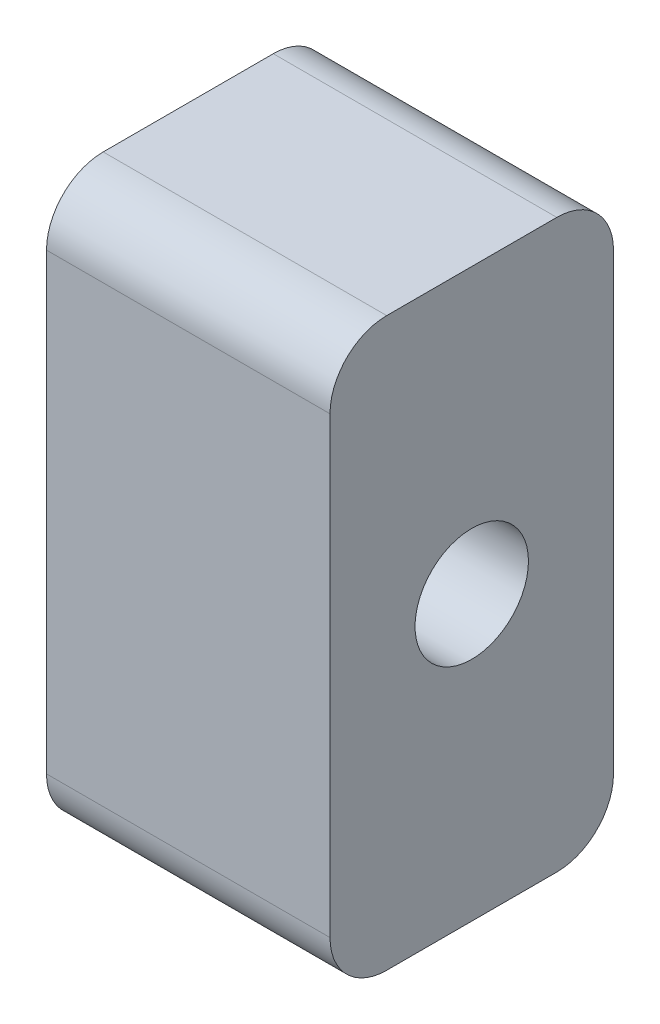
ISO-10303-21;
HEADER;
FILE_DESCRIPTION(('STEP AP214'),'2;1');
FILE_NAME('part.step','',(''),(''),'','','');
FILE_SCHEMA(('AUTOMOTIVE_DESIGN { 1 0 10303 214 1 1 1 1 }'));
ENDSEC;
DATA;
#1=APPLICATION_CONTEXT('core data for automotive mechanical design processes');
#2=APPLICATION_PROTOCOL_DEFINITION('international standard','automotive_design',2000,#1);
#3=PRODUCT_CONTEXT('',#1,'mechanical');
#4=PRODUCT('Part','Part','',(#3));
#5=PRODUCT_RELATED_PRODUCT_CATEGORY('part','',(#4));
#6=PRODUCT_DEFINITION_FORMATION('','',#4);
#7=PRODUCT_DEFINITION_CONTEXT('part definition',#1,'design');
#8=PRODUCT_DEFINITION('design','',#6,#7);
#9=PRODUCT_DEFINITION_SHAPE('','',#8);
#10=(LENGTH_UNIT() NAMED_UNIT(*) SI_UNIT(.MILLI.,.METRE.));
#11=(NAMED_UNIT(*) PLANE_ANGLE_UNIT() SI_UNIT($,.RADIAN.));
#12=(NAMED_UNIT(*) SI_UNIT($,.STERADIAN.) SOLID_ANGLE_UNIT());
#13=UNCERTAINTY_MEASURE_WITH_UNIT(LENGTH_MEASURE(1.E-05),#10,'distance_accuracy_value','');
#14=(GEOMETRIC_REPRESENTATION_CONTEXT(3) GLOBAL_UNCERTAINTY_ASSIGNED_CONTEXT((#13)) GLOBAL_UNIT_ASSIGNED_CONTEXT((#10,
#11,#12)) REPRESENTATION_CONTEXT('',''));
#15=CARTESIAN_POINT('',(0.,0.,0.));
#16=DIRECTION('',(0.,0.,1.));
#17=DIRECTION('',(1.,0.,0.));
#18=AXIS2_PLACEMENT_3D('',#15,#16,#17);
#19=CARTESIAN_POINT('',(127.,101.6,38.1));
#20=DIRECTION('',(-1.,0.,0.));
#21=DIRECTION('',(0.,0.,1.));
#22=AXIS2_PLACEMENT_3D('',#19,#20,#21);
#23=PLANE('',#22);
#24=CARTESIAN_POINT('',(127.,101.6,38.1));
#25=DIRECTION('',(1.,0.,0.));
#26=DIRECTION('',(0.,0.,1.));
#27=AXIS2_PLACEMENT_3D('',#24,#25,#26);
#28=CIRCLE('',#27,25.4);
#29=CARTESIAN_POINT('',(127.,127.,38.0999999999998));
#30=VERTEX_POINT('',#29);
#31=CARTESIAN_POINT('',(127.,101.6,63.5));
#32=VERTEX_POINT('',#31);
#33=EDGE_CURVE('E170',#30,#32,#28,.T.);
#34=ORIENTED_EDGE('',*,*,#33,.T.);
#35=DIRECTION('',(0.,-1.,0.));
#36=VECTOR('',#35,1.);
#37=CARTESIAN_POINT('',(127.,-101.6,63.5));
#38=LINE('',#37,#36);
#39=CARTESIAN_POINT('',(127.,-101.6,63.5));
#40=VERTEX_POINT('',#39);
#41=EDGE_CURVE('E106',#32,#40,#38,.T.);
#42=ORIENTED_EDGE('',*,*,#41,.T.);
#43=CARTESIAN_POINT('',(127.,-101.6,38.1));
#44=DIRECTION('',(1.,0.,0.));
#45=DIRECTION('',(0.,0.,-1.));
#46=AXIS2_PLACEMENT_3D('',#43,#44,#45);
#47=CIRCLE('',#46,25.4);
#48=CARTESIAN_POINT('',(127.,-127.,38.0999999999998));
#49=VERTEX_POINT('',#48);
#50=EDGE_CURVE('E191',#40,#49,#47,.T.);
#51=ORIENTED_EDGE('',*,*,#50,.T.);
#52=DIRECTION('',(0.,0.,-1.));
#53=VECTOR('',#52,1.);
#54=CARTESIAN_POINT('',(127.,-127.,38.0999999999998));
#55=LINE('',#54,#53);
#56=CARTESIAN_POINT('',(127.,-127.,-38.0999999999998));
#57=VERTEX_POINT('',#56);
#58=EDGE_CURVE('E205',#49,#57,#55,.T.);
#59=ORIENTED_EDGE('',*,*,#58,.T.);
#60=CARTESIAN_POINT('',(127.,-101.6,-38.1));
#61=DIRECTION('',(1.,0.,0.));
#62=DIRECTION('',(0.,0.,-1.));
#63=AXIS2_PLACEMENT_3D('',#60,#61,#62);
#64=CIRCLE('',#63,25.4);
#65=CARTESIAN_POINT('',(127.,-101.6,-63.5));
#66=VERTEX_POINT('',#65);
#67=EDGE_CURVE('E125',#57,#66,#64,.T.);
#68=ORIENTED_EDGE('',*,*,#67,.T.);
#69=DIRECTION('',(0.,1.,0.));
#70=VECTOR('',#69,1.);
#71=CARTESIAN_POINT('',(127.,-101.6,-63.5));
#72=LINE('',#71,#70);
#73=CARTESIAN_POINT('',(127.,101.6,-63.5));
#74=VERTEX_POINT('',#73);
#75=EDGE_CURVE('E119',#66,#74,#72,.T.);
#76=ORIENTED_EDGE('',*,*,#75,.T.);
#77=CARTESIAN_POINT('',(127.,101.6,-38.1));
#78=DIRECTION('',(1.,0.,0.));
#79=DIRECTION('',(0.,0.,-1.));
#80=AXIS2_PLACEMENT_3D('',#77,#78,#79);
#81=CIRCLE('',#80,25.4);
#82=CARTESIAN_POINT('',(127.,127.,-38.0999999999998));
#83=VERTEX_POINT('',#82);
#84=EDGE_CURVE('E123',#74,#83,#81,.T.);
#85=ORIENTED_EDGE('',*,*,#84,.T.);
#86=DIRECTION('',(0.,0.,1.));
#87=VECTOR('',#86,1.);
#88=CARTESIAN_POINT('',(127.,127.,38.0999999999998));
#89=LINE('',#88,#87);
#90=EDGE_CURVE('E63',#83,#30,#89,.T.);
#91=ORIENTED_EDGE('',*,*,#90,.T.);
#92=EDGE_LOOP('',(#34,#42,#51,#59,#68,#76,#85,#91));
#93=FACE_BOUND('',#92,.T.);
#94=CARTESIAN_POINT('',(127.,0.,0.));
#95=DIRECTION('',(1.,0.,0.));
#96=DIRECTION('',(0.,0.,-1.));
#97=AXIS2_PLACEMENT_3D('',#94,#95,#96);
#98=CIRCLE('',#97,25.4);
#99=CARTESIAN_POINT('',(127.,0.,-25.4));
#100=VERTEX_POINT('',#99);
#101=EDGE_CURVE('E152',#100,#100,#98,.T.);
#102=ORIENTED_EDGE('',*,*,#101,.F.);
#103=EDGE_LOOP('',(#102));
#104=FACE_BOUND('',#103,.T.);
#105=ADVANCED_FACE('F45',(#93,#104),#23,.F.);
#106=CARTESIAN_POINT('',(0.,101.6,38.1));
#107=DIRECTION('',(-1.,0.,0.));
#108=DIRECTION('',(0.,0.,1.));
#109=AXIS2_PLACEMENT_3D('',#106,#107,#108);
#110=PLANE('',#109);
#111=CARTESIAN_POINT('',(0.,101.6,38.1));
#112=DIRECTION('',(1.,0.,0.));
#113=DIRECTION('',(0.,0.,1.));
#114=AXIS2_PLACEMENT_3D('',#111,#112,#113);
#115=CIRCLE('',#114,25.4);
#116=CARTESIAN_POINT('',(0.,127.,38.0999999999998));
#117=VERTEX_POINT('',#116);
#118=CARTESIAN_POINT('',(0.,101.6,63.5));
#119=VERTEX_POINT('',#118);
#120=EDGE_CURVE('E147',#117,#119,#115,.T.);
#121=ORIENTED_EDGE('',*,*,#120,.F.);
#122=DIRECTION('',(0.,0.,1.));
#123=VECTOR('',#122,1.);
#124=CARTESIAN_POINT('',(0.,127.,38.0999999999998));
#125=LINE('',#124,#123);
#126=CARTESIAN_POINT('',(0.,127.,-38.0999999999998));
#127=VERTEX_POINT('',#126);
#128=EDGE_CURVE('E98',#127,#117,#125,.T.);
#129=ORIENTED_EDGE('',*,*,#128,.F.);
#130=CARTESIAN_POINT('',(0.,101.6,-38.1));
#131=DIRECTION('',(1.,0.,0.));
#132=DIRECTION('',(0.,0.,-1.));
#133=AXIS2_PLACEMENT_3D('',#130,#131,#132);
#134=CIRCLE('',#133,25.4);
#135=CARTESIAN_POINT('',(0.,101.6,-63.5));
#136=VERTEX_POINT('',#135);
#137=EDGE_CURVE('E92',#136,#127,#134,.T.);
#138=ORIENTED_EDGE('',*,*,#137,.F.);
#139=DIRECTION('',(0.,1.,0.));
#140=VECTOR('',#139,1.);
#141=CARTESIAN_POINT('',(0.,-101.6,-63.5));
#142=LINE('',#141,#140);
#143=CARTESIAN_POINT('',(0.,-101.6,-63.5));
#144=VERTEX_POINT('',#143);
#145=EDGE_CURVE('E134',#144,#136,#142,.T.);
#146=ORIENTED_EDGE('',*,*,#145,.F.);
#147=CARTESIAN_POINT('',(0.,-101.6,-38.1));
#148=DIRECTION('',(1.,0.,0.));
#149=DIRECTION('',(0.,0.,-1.));
#150=AXIS2_PLACEMENT_3D('',#147,#148,#149);
#151=CIRCLE('',#150,25.4);
#152=CARTESIAN_POINT('',(0.,-127.,-38.0999999999998));
#153=VERTEX_POINT('',#152);
#154=EDGE_CURVE('E161',#153,#144,#151,.T.);
#155=ORIENTED_EDGE('',*,*,#154,.F.);
#156=DIRECTION('',(0.,0.,-1.));
#157=VECTOR('',#156,1.);
#158=CARTESIAN_POINT('',(0.,-127.,38.0999999999998));
#159=LINE('',#158,#157);
#160=CARTESIAN_POINT('',(0.,-127.,38.0999999999998));
#161=VERTEX_POINT('',#160);
#162=EDGE_CURVE('E158',#161,#153,#159,.T.);
#163=ORIENTED_EDGE('',*,*,#162,.F.);
#164=CARTESIAN_POINT('',(0.,-101.6,38.1));
#165=DIRECTION('',(1.,0.,0.));
#166=DIRECTION('',(0.,0.,-1.));
#167=AXIS2_PLACEMENT_3D('',#164,#165,#166);
#168=CIRCLE('',#167,25.4);
#169=CARTESIAN_POINT('',(0.,-101.6,63.5));
#170=VERTEX_POINT('',#169);
#171=EDGE_CURVE('E155',#170,#161,#168,.T.);
#172=ORIENTED_EDGE('',*,*,#171,.F.);
#173=DIRECTION('',(0.,-1.,0.));
#174=VECTOR('',#173,1.);
#175=CARTESIAN_POINT('',(0.,-101.6,63.5));
#176=LINE('',#175,#174);
#177=EDGE_CURVE('E151',#119,#170,#176,.T.);
#178=ORIENTED_EDGE('',*,*,#177,.F.);
#179=EDGE_LOOP('',(#121,#129,#138,#146,#155,#163,#172,#178));
#180=FACE_BOUND('',#179,.T.);
#181=CARTESIAN_POINT('',(0.,0.,0.));
#182=DIRECTION('',(1.,0.,0.));
#183=DIRECTION('',(0.,0.,-1.));
#184=AXIS2_PLACEMENT_3D('',#181,#182,#183);
#185=CIRCLE('',#184,25.4);
#186=CARTESIAN_POINT('',(0.,0.,-25.4));
#187=VERTEX_POINT('',#186);
#188=EDGE_CURVE('E215',#187,#187,#185,.T.);
#189=ORIENTED_EDGE('',*,*,#188,.T.);
#190=EDGE_LOOP('',(#189));
#191=FACE_BOUND('',#190,.T.);
#192=ADVANCED_FACE('F195',(#180,#191),#110,.T.);
#193=CARTESIAN_POINT('',(127.,101.6,38.1));
#194=DIRECTION('',(-1.,0.,0.));
#195=DIRECTION('',(0.,0.,1.));
#196=AXIS2_PLACEMENT_3D('',#193,#194,#195);
#197=CYLINDRICAL_SURFACE('',#196,25.4);
#198=ORIENTED_EDGE('',*,*,#120,.T.);
#199=DIRECTION('',(-1.,0.,0.));
#200=VECTOR('',#199,1.);
#201=CARTESIAN_POINT('',(127.,101.6,63.5));
#202=LINE('',#201,#200);
#203=EDGE_CURVE('E11',#32,#119,#202,.T.);
#204=ORIENTED_EDGE('',*,*,#203,.F.);
#205=ORIENTED_EDGE('',*,*,#33,.F.);
#206=DIRECTION('',(-1.,0.,0.));
#207=VECTOR('',#206,1.);
#208=CARTESIAN_POINT('',(127.,127.,38.0999999999998));
#209=LINE('',#208,#207);
#210=EDGE_CURVE('E143',#30,#117,#209,.T.);
#211=ORIENTED_EDGE('',*,*,#210,.T.);
#212=EDGE_LOOP('',(#198,#204,#205,#211));
#213=FACE_BOUND('',#212,.T.);
#214=ADVANCED_FACE('F47',(#213),#197,.T.);
#215=CARTESIAN_POINT('',(127.,-101.6,63.5));
#216=DIRECTION('',(0.,0.,-1.));
#217=DIRECTION('',(-1.,0.,0.));
#218=AXIS2_PLACEMENT_3D('',#215,#216,#217);
#219=PLANE('',#218);
#220=ORIENTED_EDGE('',*,*,#177,.T.);
#221=DIRECTION('',(-1.,0.,0.));
#222=VECTOR('',#221,1.);
#223=CARTESIAN_POINT('',(127.,-101.6,63.5));
#224=LINE('',#223,#222);
#225=EDGE_CURVE('E55',#40,#170,#224,.T.);
#226=ORIENTED_EDGE('',*,*,#225,.F.);
#227=ORIENTED_EDGE('',*,*,#41,.F.);
#228=ORIENTED_EDGE('',*,*,#203,.T.);
#229=EDGE_LOOP('',(#220,#226,#227,#228));
#230=FACE_BOUND('',#229,.T.);
#231=ADVANCED_FACE('F245',(#230),#219,.F.);
#232=CARTESIAN_POINT('',(127.,-101.6,38.1));
#233=DIRECTION('',(-1.,0.,0.));
#234=DIRECTION('',(0.,0.,1.));
#235=AXIS2_PLACEMENT_3D('',#232,#233,#234);
#236=CYLINDRICAL_SURFACE('',#235,25.4);
#237=ORIENTED_EDGE('',*,*,#171,.T.);
#238=DIRECTION('',(-1.,0.,0.));
#239=VECTOR('',#238,1.);
#240=CARTESIAN_POINT('',(127.,-127.,38.0999999999998));
#241=LINE('',#240,#239);
#242=EDGE_CURVE('E181',#49,#161,#241,.T.);
#243=ORIENTED_EDGE('',*,*,#242,.F.);
#244=ORIENTED_EDGE('',*,*,#50,.F.);
#245=ORIENTED_EDGE('',*,*,#225,.T.);
#246=EDGE_LOOP('',(#237,#243,#244,#245));
#247=FACE_BOUND('',#246,.T.);
#248=ADVANCED_FACE('F189',(#247),#236,.T.);
#249=CARTESIAN_POINT('',(127.,-127.,38.0999999999998));
#250=DIRECTION('',(0.,1.,0.));
#251=DIRECTION('',(0.,0.,1.));
#252=AXIS2_PLACEMENT_3D('',#249,#250,#251);
#253=PLANE('',#252);
#254=ORIENTED_EDGE('',*,*,#162,.T.);
#255=DIRECTION('',(-1.,0.,0.));
#256=VECTOR('',#255,1.);
#257=CARTESIAN_POINT('',(127.,-127.,-38.0999999999998));
#258=LINE('',#257,#256);
#259=EDGE_CURVE('E177',#57,#153,#258,.T.);
#260=ORIENTED_EDGE('',*,*,#259,.F.);
#261=ORIENTED_EDGE('',*,*,#58,.F.);
#262=ORIENTED_EDGE('',*,*,#242,.T.);
#263=EDGE_LOOP('',(#254,#260,#261,#262));
#264=FACE_BOUND('',#263,.T.);
#265=ADVANCED_FACE('F200',(#264),#253,.F.);
#266=CARTESIAN_POINT('',(127.,-101.6,-38.1));
#267=DIRECTION('',(-1.,0.,0.));
#268=DIRECTION('',(0.,0.,1.));
#269=AXIS2_PLACEMENT_3D('',#266,#267,#268);
#270=CYLINDRICAL_SURFACE('',#269,25.4);
#271=ORIENTED_EDGE('',*,*,#154,.T.);
#272=DIRECTION('',(-1.,0.,0.));
#273=VECTOR('',#272,1.);
#274=CARTESIAN_POINT('',(127.,-101.6,-63.5));
#275=LINE('',#274,#273);
#276=EDGE_CURVE('E136',#66,#144,#275,.T.);
#277=ORIENTED_EDGE('',*,*,#276,.F.);
#278=ORIENTED_EDGE('',*,*,#67,.F.);
#279=ORIENTED_EDGE('',*,*,#259,.T.);
#280=EDGE_LOOP('',(#271,#277,#278,#279));
#281=FACE_BOUND('',#280,.T.);
#282=ADVANCED_FACE('F203',(#281),#270,.T.);
#283=CARTESIAN_POINT('',(127.,-101.6,-63.5));
#284=DIRECTION('',(0.,0.,1.));
#285=DIRECTION('',(1.,0.,0.));
#286=AXIS2_PLACEMENT_3D('',#283,#284,#285);
#287=PLANE('',#286);
#288=ORIENTED_EDGE('',*,*,#145,.T.);
#289=DIRECTION('',(-1.,0.,0.));
#290=VECTOR('',#289,1.);
#291=CARTESIAN_POINT('',(127.,101.6,-63.5));
#292=LINE('',#291,#290);
#293=EDGE_CURVE('E131',#74,#136,#292,.T.);
#294=ORIENTED_EDGE('',*,*,#293,.F.);
#295=ORIENTED_EDGE('',*,*,#75,.F.);
#296=ORIENTED_EDGE('',*,*,#276,.T.);
#297=EDGE_LOOP('',(#288,#294,#295,#296));
#298=FACE_BOUND('',#297,.T.);
#299=ADVANCED_FACE('F132',(#298),#287,.F.);
#300=CARTESIAN_POINT('',(127.,101.6,-38.1));
#301=DIRECTION('',(-1.,0.,0.));
#302=DIRECTION('',(0.,0.,1.));
#303=AXIS2_PLACEMENT_3D('',#300,#301,#302);
#304=CYLINDRICAL_SURFACE('',#303,25.4);
#305=ORIENTED_EDGE('',*,*,#137,.T.);
#306=DIRECTION('',(-1.,0.,0.));
#307=VECTOR('',#306,1.);
#308=CARTESIAN_POINT('',(127.,127.,-38.0999999999998));
#309=LINE('',#308,#307);
#310=EDGE_CURVE('E137',#83,#127,#309,.T.);
#311=ORIENTED_EDGE('',*,*,#310,.F.);
#312=ORIENTED_EDGE('',*,*,#84,.F.);
#313=ORIENTED_EDGE('',*,*,#293,.T.);
#314=EDGE_LOOP('',(#305,#311,#312,#313));
#315=FACE_BOUND('',#314,.T.);
#316=ADVANCED_FACE('F139',(#315),#304,.T.);
#317=CARTESIAN_POINT('',(127.,127.,38.0999999999998));
#318=DIRECTION('',(0.,-1.,0.));
#319=DIRECTION('',(0.,0.,-1.));
#320=AXIS2_PLACEMENT_3D('',#317,#318,#319);
#321=PLANE('',#320);
#322=ORIENTED_EDGE('',*,*,#128,.T.);
#323=ORIENTED_EDGE('',*,*,#210,.F.);
#324=ORIENTED_EDGE('',*,*,#90,.F.);
#325=ORIENTED_EDGE('',*,*,#310,.T.);
#326=EDGE_LOOP('',(#322,#323,#324,#325));
#327=FACE_BOUND('',#326,.T.);
#328=ADVANCED_FACE('F233',(#327),#321,.F.);
#329=CARTESIAN_POINT('',(127.,0.,0.));
#330=DIRECTION('',(-1.,0.,0.));
#331=DIRECTION('',(0.,0.,1.));
#332=AXIS2_PLACEMENT_3D('',#329,#330,#331);
#333=CYLINDRICAL_SURFACE('',#332,25.4);
#334=ORIENTED_EDGE('',*,*,#101,.T.);
#335=EDGE_LOOP('',(#334));
#336=FACE_BOUND('',#335,.T.);
#337=ORIENTED_EDGE('',*,*,#188,.F.);
#338=EDGE_LOOP('',(#337));
#339=FACE_BOUND('',#338,.T.);
#340=ADVANCED_FACE('F223',(#336,#339),#333,.F.);
#341=CLOSED_SHELL('',(#105,#192,#214,#231,#248,#265,#282,#299,#316,#328,#340));
#342=MANIFOLD_SOLID_BREP('B2',#341);
#343=ADVANCED_BREP_SHAPE_REPRESENTATION('',(#18,#342),#14);
#344=SHAPE_DEFINITION_REPRESENTATION(#9,#343);
ENDSEC;
END-ISO-10303-21;
